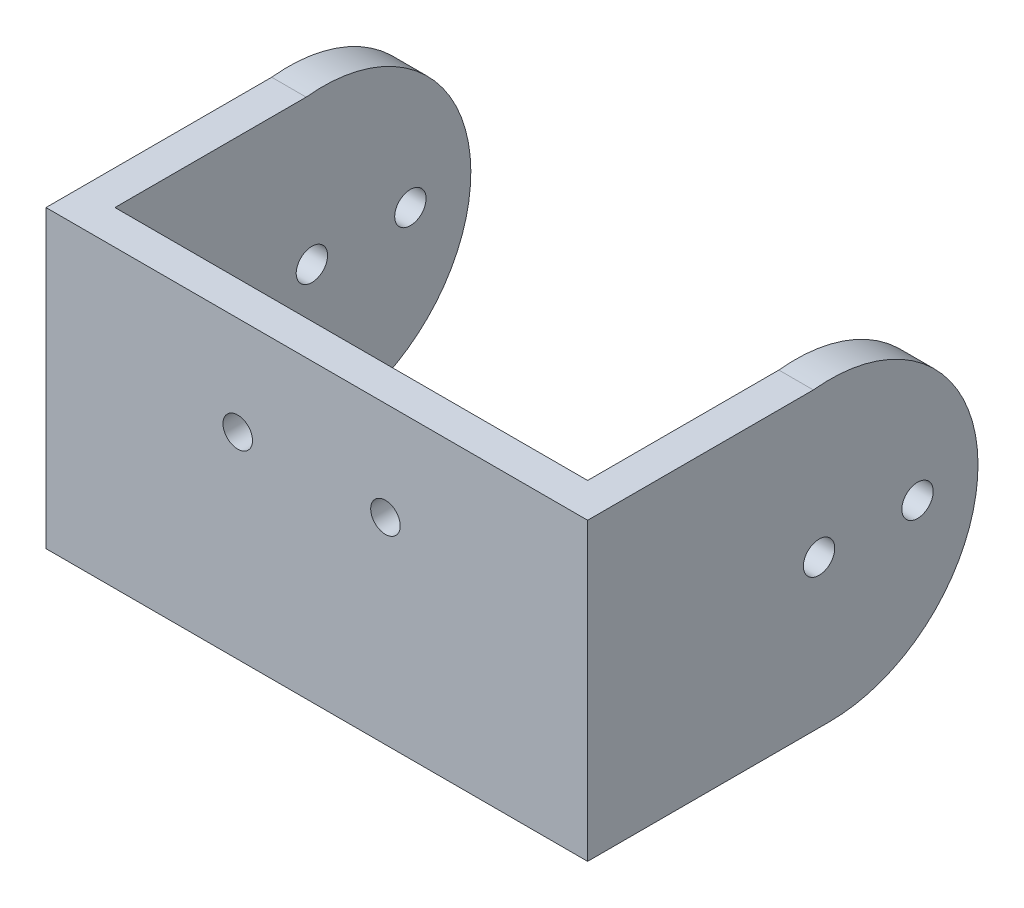
ISO-10303-21;
HEADER;
FILE_DESCRIPTION(('STEP AP214'),'2;1');
FILE_NAME('part.step','',(''),(''),'','','');
FILE_SCHEMA(('AUTOMOTIVE_DESIGN { 1 0 10303 214 1 1 1 1 }'));
ENDSEC;
DATA;
#1=APPLICATION_CONTEXT('core data for automotive mechanical design processes');
#2=APPLICATION_PROTOCOL_DEFINITION('international standard','automotive_design',2000,#1);
#3=PRODUCT_CONTEXT('',#1,'mechanical');
#4=PRODUCT('Part','Part','',(#3));
#5=PRODUCT_RELATED_PRODUCT_CATEGORY('part','',(#4));
#6=PRODUCT_DEFINITION_FORMATION('','',#4);
#7=PRODUCT_DEFINITION_CONTEXT('part definition',#1,'design');
#8=PRODUCT_DEFINITION('design','',#6,#7);
#9=PRODUCT_DEFINITION_SHAPE('','',#8);
#10=(LENGTH_UNIT() NAMED_UNIT(*) SI_UNIT(.MILLI.,.METRE.));
#11=(NAMED_UNIT(*) PLANE_ANGLE_UNIT() SI_UNIT($,.RADIAN.));
#12=(NAMED_UNIT(*) SI_UNIT($,.STERADIAN.) SOLID_ANGLE_UNIT());
#13=UNCERTAINTY_MEASURE_WITH_UNIT(LENGTH_MEASURE(1.E-05),#10,'distance_accuracy_value','');
#14=(GEOMETRIC_REPRESENTATION_CONTEXT(3) GLOBAL_UNCERTAINTY_ASSIGNED_CONTEXT((#13)) GLOBAL_UNIT_ASSIGNED_CONTEXT((#10,
#11,#12)) REPRESENTATION_CONTEXT('',''));
#15=CARTESIAN_POINT('',(0.,0.,0.));
#16=DIRECTION('',(0.,0.,1.));
#17=DIRECTION('',(1.,0.,0.));
#18=AXIS2_PLACEMENT_3D('',#15,#16,#17);
#19=CARTESIAN_POINT('',(-27.5,-15.,3.5));
#20=DIRECTION('',(1.,0.,0.));
#21=DIRECTION('',(0.,1.,0.));
#22=AXIS2_PLACEMENT_3D('',#19,#20,#21);
#23=PLANE('',#22);
#24=DIRECTION('',(0.,0.,-1.));
#25=VECTOR('',#24,1.);
#26=CARTESIAN_POINT('',(-27.5,15.,3.5));
#27=LINE('',#26,#25);
#28=CARTESIAN_POINT('',(-27.5,15.,3.5));
#29=VERTEX_POINT('',#28);
#30=CARTESIAN_POINT('',(-27.5,15.,-19.4197675165418));
#31=VERTEX_POINT('',#30);
#32=EDGE_CURVE('E200',#29,#31,#27,.T.);
#33=ORIENTED_EDGE('',*,*,#32,.T.);
#34=CARTESIAN_POINT('',(-27.5,0.046519708681584,-21.0930394173632));
#35=DIRECTION('',(1.,0.,0.));
#36=DIRECTION('',(0.,0.,1.));
#37=AXIS2_PLACEMENT_3D('',#34,#35,#36);
#38=CIRCLE('',#37,15.0468073582713);
#39=CARTESIAN_POINT('',(-27.5,-15.,-21.0000000000001));
#40=VERTEX_POINT('',#39);
#41=EDGE_CURVE('E118',#40,#31,#38,.T.);
#42=ORIENTED_EDGE('',*,*,#41,.F.);
#43=DIRECTION('',(0.,0.,-1.));
#44=VECTOR('',#43,1.);
#45=CARTESIAN_POINT('',(-27.5,-15.,3.5));
#46=LINE('',#45,#44);
#47=CARTESIAN_POINT('',(-27.5,-15.,3.5));
#48=VERTEX_POINT('',#47);
#49=EDGE_CURVE('E11',#48,#40,#46,.T.);
#50=ORIENTED_EDGE('',*,*,#49,.F.);
#51=DIRECTION('',(0.,-1.,0.));
#52=VECTOR('',#51,1.);
#53=CARTESIAN_POINT('',(-27.5,-15.,3.5));
#54=LINE('',#53,#52);
#55=EDGE_CURVE('E187',#29,#48,#54,.T.);
#56=ORIENTED_EDGE('',*,*,#55,.F.);
#57=EDGE_LOOP('',(#33,#42,#50,#56));
#58=FACE_BOUND('',#57,.T.);
#59=CARTESIAN_POINT('',(-27.5,0.,-20.));
#60=DIRECTION('',(1.,0.,0.));
#61=DIRECTION('',(0.,0.,-1.));
#62=AXIS2_PLACEMENT_3D('',#59,#60,#61);
#63=CIRCLE('',#62,1.59272352570657);
#64=CARTESIAN_POINT('',(-27.5,0.,-21.5927235257066));
#65=VERTEX_POINT('',#64);
#66=EDGE_CURVE('E136',#65,#65,#63,.T.);
#67=ORIENTED_EDGE('',*,*,#66,.T.);
#68=EDGE_LOOP('',(#67));
#69=FACE_BOUND('',#68,.T.);
#70=CARTESIAN_POINT('',(-27.5,-1.81701141093459E-13,-30.));
#71=DIRECTION('',(1.,0.,0.));
#72=DIRECTION('',(0.,0.,1.));
#73=AXIS2_PLACEMENT_3D('',#70,#71,#72);
#74=CIRCLE('',#73,1.59272352570657);
#75=CARTESIAN_POINT('',(-27.5,-1.81701141093459E-13,-28.4072764742934));
#76=VERTEX_POINT('',#75);
#77=EDGE_CURVE('E253',#76,#76,#74,.T.);
#78=ORIENTED_EDGE('',*,*,#77,.T.);
#79=EDGE_LOOP('',(#78));
#80=FACE_BOUND('',#79,.T.);
#81=ADVANCED_FACE('F39',(#58,#69,#80),#23,.F.);
#82=CARTESIAN_POINT('',(27.5,-15.,3.5));
#83=DIRECTION('',(0.,1.,0.));
#84=DIRECTION('',(-1.,0.,0.));
#85=AXIS2_PLACEMENT_3D('',#82,#83,#84);
#86=PLANE('',#85);
#87=ORIENTED_EDGE('',*,*,#49,.T.);
#88=DIRECTION('',(-1.,0.,0.));
#89=VECTOR('',#88,1.);
#90=CARTESIAN_POINT('',(-24.,-15.,-21.0000000000001));
#91=LINE('',#90,#89);
#92=CARTESIAN_POINT('',(-24.,-15.,-21.0000000000001));
#93=VERTEX_POINT('',#92);
#94=EDGE_CURVE('E122',#93,#40,#91,.T.);
#95=ORIENTED_EDGE('',*,*,#94,.F.);
#96=DIRECTION('',(0.,0.,-1.));
#97=VECTOR('',#96,1.);
#98=CARTESIAN_POINT('',(-24.,-15.,0.));
#99=LINE('',#98,#97);
#100=CARTESIAN_POINT('',(-24.,-15.,0.));
#101=VERTEX_POINT('',#100);
#102=EDGE_CURVE('E54',#101,#93,#99,.T.);
#103=ORIENTED_EDGE('',*,*,#102,.F.);
#104=DIRECTION('',(1.,0.,0.));
#105=VECTOR('',#104,1.);
#106=CARTESIAN_POINT('',(27.5,-15.,0.));
#107=LINE('',#106,#105);
#108=CARTESIAN_POINT('',(24.,-15.,0.));
#109=VERTEX_POINT('',#108);
#110=EDGE_CURVE('E59',#101,#109,#107,.T.);
#111=ORIENTED_EDGE('',*,*,#110,.T.);
#112=DIRECTION('',(0.,0.,-1.));
#113=VECTOR('',#112,1.);
#114=CARTESIAN_POINT('',(24.,-15.,0.));
#115=LINE('',#114,#113);
#116=CARTESIAN_POINT('',(24.,-15.,-21.0000000000001));
#117=VERTEX_POINT('',#116);
#118=EDGE_CURVE('E169',#109,#117,#115,.T.);
#119=ORIENTED_EDGE('',*,*,#118,.T.);
#120=DIRECTION('',(1.,0.,0.));
#121=VECTOR('',#120,1.);
#122=CARTESIAN_POINT('',(24.,-15.,-21.0000000000001));
#123=LINE('',#122,#121);
#124=CARTESIAN_POINT('',(27.5,-15.,-21.0000000000001));
#125=VERTEX_POINT('',#124);
#126=EDGE_CURVE('E176',#117,#125,#123,.T.);
#127=ORIENTED_EDGE('',*,*,#126,.T.);
#128=DIRECTION('',(0.,0.,-1.));
#129=VECTOR('',#128,1.);
#130=CARTESIAN_POINT('',(27.5,-15.,3.5));
#131=LINE('',#130,#129);
#132=CARTESIAN_POINT('',(27.5,-15.,3.5));
#133=VERTEX_POINT('',#132);
#134=EDGE_CURVE('E47',#133,#125,#131,.T.);
#135=ORIENTED_EDGE('',*,*,#134,.F.);
#136=DIRECTION('',(1.,0.,0.));
#137=VECTOR('',#136,1.);
#138=CARTESIAN_POINT('',(27.5,-15.,3.5));
#139=LINE('',#138,#137);
#140=EDGE_CURVE('E191',#48,#133,#139,.T.);
#141=ORIENTED_EDGE('',*,*,#140,.F.);
#142=EDGE_LOOP('',(#87,#95,#103,#111,#119,#127,#135,#141));
#143=FACE_BOUND('',#142,.T.);
#144=ADVANCED_FACE('F217',(#143),#86,.F.);
#145=CARTESIAN_POINT('',(27.5,-15.,3.5));
#146=DIRECTION('',(-1.,0.,0.));
#147=DIRECTION('',(0.,0.,1.));
#148=AXIS2_PLACEMENT_3D('',#145,#146,#147);
#149=PLANE('',#148);
#150=ORIENTED_EDGE('',*,*,#134,.T.);
#151=CARTESIAN_POINT('',(27.5,0.046519708681584,-21.0930394173632));
#152=DIRECTION('',(1.,0.,0.));
#153=DIRECTION('',(0.,0.,1.));
#154=AXIS2_PLACEMENT_3D('',#151,#152,#153);
#155=CIRCLE('',#154,15.0468073582713);
#156=CARTESIAN_POINT('',(27.5,15.,-19.4197675165418));
#157=VERTEX_POINT('',#156);
#158=EDGE_CURVE('E158',#125,#157,#155,.T.);
#159=ORIENTED_EDGE('',*,*,#158,.T.);
#160=DIRECTION('',(0.,0.,-1.));
#161=VECTOR('',#160,1.);
#162=CARTESIAN_POINT('',(27.5,15.,3.5));
#163=LINE('',#162,#161);
#164=CARTESIAN_POINT('',(27.5,15.,3.5));
#165=VERTEX_POINT('',#164);
#166=EDGE_CURVE('E207',#165,#157,#163,.T.);
#167=ORIENTED_EDGE('',*,*,#166,.F.);
#168=DIRECTION('',(0.,1.,0.));
#169=VECTOR('',#168,1.);
#170=CARTESIAN_POINT('',(27.5,-15.,3.5));
#171=LINE('',#170,#169);
#172=EDGE_CURVE('E194',#133,#165,#171,.T.);
#173=ORIENTED_EDGE('',*,*,#172,.F.);
#174=EDGE_LOOP('',(#150,#159,#167,#173));
#175=FACE_BOUND('',#174,.T.);
#176=CARTESIAN_POINT('',(27.5,-1.81701141093459E-13,-30.));
#177=DIRECTION('',(1.,0.,0.));
#178=DIRECTION('',(0.,0.,1.));
#179=AXIS2_PLACEMENT_3D('',#176,#177,#178);
#180=CIRCLE('',#179,1.59272352570657);
#181=CARTESIAN_POINT('',(27.5,-1.81701141093459E-13,-28.4072764742934));
#182=VERTEX_POINT('',#181);
#183=EDGE_CURVE('E144',#182,#182,#180,.T.);
#184=ORIENTED_EDGE('',*,*,#183,.F.);
#185=EDGE_LOOP('',(#184));
#186=FACE_BOUND('',#185,.T.);
#187=CARTESIAN_POINT('',(27.5,0.,-20.));
#188=DIRECTION('',(1.,0.,0.));
#189=DIRECTION('',(0.,0.,-1.));
#190=AXIS2_PLACEMENT_3D('',#187,#188,#189);
#191=CIRCLE('',#190,1.59272352570657);
#192=CARTESIAN_POINT('',(27.5,0.,-21.5927235257066));
#193=VERTEX_POINT('',#192);
#194=EDGE_CURVE('E150',#193,#193,#191,.T.);
#195=ORIENTED_EDGE('',*,*,#194,.F.);
#196=EDGE_LOOP('',(#195));
#197=FACE_BOUND('',#196,.T.);
#198=ADVANCED_FACE('F213',(#175,#186,#197),#149,.F.);
#199=CARTESIAN_POINT('',(27.5,15.,3.5));
#200=DIRECTION('',(0.,-1.,0.));
#201=DIRECTION('',(1.,0.,0.));
#202=AXIS2_PLACEMENT_3D('',#199,#200,#201);
#203=PLANE('',#202);
#204=ORIENTED_EDGE('',*,*,#166,.T.);
#205=DIRECTION('',(1.,0.,0.));
#206=VECTOR('',#205,1.);
#207=CARTESIAN_POINT('',(24.,15.,-19.4197675165418));
#208=LINE('',#207,#206);
#209=CARTESIAN_POINT('',(24.,15.,-19.4197675165418));
#210=VERTEX_POINT('',#209);
#211=EDGE_CURVE('E180',#210,#157,#208,.T.);
#212=ORIENTED_EDGE('',*,*,#211,.F.);
#213=DIRECTION('',(0.,0.,1.));
#214=VECTOR('',#213,1.);
#215=CARTESIAN_POINT('',(24.,15.,-19.4197675165418));
#216=LINE('',#215,#214);
#217=CARTESIAN_POINT('',(24.,15.,0.));
#218=VERTEX_POINT('',#217);
#219=EDGE_CURVE('E162',#210,#218,#216,.T.);
#220=ORIENTED_EDGE('',*,*,#219,.T.);
#221=DIRECTION('',(-1.,0.,0.));
#222=VECTOR('',#221,1.);
#223=CARTESIAN_POINT('',(27.5,15.,0.));
#224=LINE('',#223,#222);
#225=CARTESIAN_POINT('',(-24.,15.,0.));
#226=VERTEX_POINT('',#225);
#227=EDGE_CURVE('E129',#218,#226,#224,.T.);
#228=ORIENTED_EDGE('',*,*,#227,.T.);
#229=DIRECTION('',(0.,0.,1.));
#230=VECTOR('',#229,1.);
#231=CARTESIAN_POINT('',(-24.,15.,-19.4197675165418));
#232=LINE('',#231,#230);
#233=CARTESIAN_POINT('',(-24.,15.,-19.4197675165418));
#234=VERTEX_POINT('',#233);
#235=EDGE_CURVE('E107',#234,#226,#232,.T.);
#236=ORIENTED_EDGE('',*,*,#235,.F.);
#237=DIRECTION('',(-1.,0.,0.));
#238=VECTOR('',#237,1.);
#239=CARTESIAN_POINT('',(-24.,15.,-19.4197675165418));
#240=LINE('',#239,#238);
#241=EDGE_CURVE('E115',#234,#31,#240,.T.);
#242=ORIENTED_EDGE('',*,*,#241,.T.);
#243=ORIENTED_EDGE('',*,*,#32,.F.);
#244=DIRECTION('',(-1.,0.,0.));
#245=VECTOR('',#244,1.);
#246=CARTESIAN_POINT('',(27.5,15.,3.5));
#247=LINE('',#246,#245);
#248=EDGE_CURVE('E197',#165,#29,#247,.T.);
#249=ORIENTED_EDGE('',*,*,#248,.F.);
#250=EDGE_LOOP('',(#204,#212,#220,#228,#236,#242,#243,#249));
#251=FACE_BOUND('',#250,.T.);
#252=ADVANCED_FACE('F126',(#251),#203,.F.);
#253=CARTESIAN_POINT('',(0.,0.,3.5));
#254=DIRECTION('',(0.,0.,1.));
#255=DIRECTION('',(1.,0.,0.));
#256=AXIS2_PLACEMENT_3D('',#253,#254,#255);
#257=PLANE('',#256);
#258=CARTESIAN_POINT('',(6.97003369074222,4.99000000000001,3.5));
#259=DIRECTION('',(0.,0.,1.));
#260=DIRECTION('',(-1.,0.,0.));
#261=AXIS2_PLACEMENT_3D('',#258,#259,#260);
#262=CIRCLE('',#261,1.5);
#263=CARTESIAN_POINT('',(5.47003369074222,4.99000000000001,3.5));
#264=VERTEX_POINT('',#263);
#265=EDGE_CURVE('E263',#264,#264,#262,.T.);
#266=ORIENTED_EDGE('',*,*,#265,.F.);
#267=EDGE_LOOP('',(#266));
#268=FACE_BOUND('',#267,.T.);
#269=CARTESIAN_POINT('',(-8.02996630925778,4.99000000000001,3.5));
#270=DIRECTION('',(0.,0.,1.));
#271=DIRECTION('',(-1.,0.,0.));
#272=AXIS2_PLACEMENT_3D('',#269,#270,#271);
#273=CIRCLE('',#272,1.5);
#274=CARTESIAN_POINT('',(-9.52996630925778,4.99000000000001,3.5));
#275=VERTEX_POINT('',#274);
#276=EDGE_CURVE('E432',#275,#275,#273,.T.);
#277=ORIENTED_EDGE('',*,*,#276,.F.);
#278=EDGE_LOOP('',(#277));
#279=FACE_BOUND('',#278,.T.);
#280=ORIENTED_EDGE('',*,*,#55,.T.);
#281=ORIENTED_EDGE('',*,*,#140,.T.);
#282=ORIENTED_EDGE('',*,*,#172,.T.);
#283=ORIENTED_EDGE('',*,*,#248,.T.);
#284=EDGE_LOOP('',(#280,#281,#282,#283));
#285=FACE_BOUND('',#284,.T.);
#286=ADVANCED_FACE('F228',(#268,#279,#285),#257,.T.);
#287=CARTESIAN_POINT('',(0.,0.,0.));
#288=DIRECTION('',(0.,0.,1.));
#289=DIRECTION('',(1.,0.,0.));
#290=AXIS2_PLACEMENT_3D('',#287,#288,#289);
#291=PLANE('',#290);
#292=CARTESIAN_POINT('',(6.97003369074222,4.99000000000001,0.));
#293=DIRECTION('',(0.,0.,1.));
#294=DIRECTION('',(-1.,0.,0.));
#295=AXIS2_PLACEMENT_3D('',#292,#293,#294);
#296=CIRCLE('',#295,1.5);
#297=CARTESIAN_POINT('',(5.47003369074222,4.99000000000001,0.));
#298=VERTEX_POINT('',#297);
#299=EDGE_CURVE('E257',#298,#298,#296,.T.);
#300=ORIENTED_EDGE('',*,*,#299,.T.);
#301=EDGE_LOOP('',(#300));
#302=FACE_BOUND('',#301,.T.);
#303=CARTESIAN_POINT('',(-8.02996630925778,4.99000000000001,0.));
#304=DIRECTION('',(0.,0.,1.));
#305=DIRECTION('',(-1.,0.,0.));
#306=AXIS2_PLACEMENT_3D('',#303,#304,#305);
#307=CIRCLE('',#306,1.5);
#308=CARTESIAN_POINT('',(-9.52996630925778,4.99000000000001,0.));
#309=VERTEX_POINT('',#308);
#310=EDGE_CURVE('E428',#309,#309,#307,.T.);
#311=ORIENTED_EDGE('',*,*,#310,.T.);
#312=EDGE_LOOP('',(#311));
#313=FACE_BOUND('',#312,.T.);
#314=ORIENTED_EDGE('',*,*,#110,.F.);
#315=DIRECTION('',(0.,-1.,0.));
#316=VECTOR('',#315,1.);
#317=CARTESIAN_POINT('',(-24.,15.,0.));
#318=LINE('',#317,#316);
#319=EDGE_CURVE('E123',#226,#101,#318,.T.);
#320=ORIENTED_EDGE('',*,*,#319,.F.);
#321=ORIENTED_EDGE('',*,*,#227,.F.);
#322=DIRECTION('',(0.,-1.,0.));
#323=VECTOR('',#322,1.);
#324=CARTESIAN_POINT('',(24.,15.,0.));
#325=LINE('',#324,#323);
#326=EDGE_CURVE('E165',#218,#109,#325,.T.);
#327=ORIENTED_EDGE('',*,*,#326,.T.);
#328=EDGE_LOOP('',(#314,#320,#321,#327));
#329=FACE_BOUND('',#328,.T.);
#330=ADVANCED_FACE('F226',(#302,#313,#329),#291,.F.);
#331=CARTESIAN_POINT('',(24.,0.046519708681584,-21.0930394173632));
#332=DIRECTION('',(1.,0.,0.));
#333=DIRECTION('',(0.,0.,-1.));
#334=AXIS2_PLACEMENT_3D('',#331,#332,#333);
#335=CYLINDRICAL_SURFACE('',#334,15.0468073582713);
#336=ORIENTED_EDGE('',*,*,#158,.F.);
#337=ORIENTED_EDGE('',*,*,#126,.F.);
#338=CARTESIAN_POINT('',(24.,0.046519708681584,-21.0930394173632));
#339=DIRECTION('',(1.,0.,0.));
#340=DIRECTION('',(0.,0.,1.));
#341=AXIS2_PLACEMENT_3D('',#338,#339,#340);
#342=CIRCLE('',#341,15.0468073582713);
#343=EDGE_CURVE('E172',#117,#210,#342,.T.);
#344=ORIENTED_EDGE('',*,*,#343,.T.);
#345=ORIENTED_EDGE('',*,*,#211,.T.);
#346=EDGE_LOOP('',(#336,#337,#344,#345));
#347=FACE_BOUND('',#346,.T.);
#348=ADVANCED_FACE('F220',(#347),#335,.T.);
#349=CARTESIAN_POINT('',(24.,0.046519708681584,-21.0930394173632));
#350=DIRECTION('',(-1.,0.,0.));
#351=DIRECTION('',(0.,0.,1.));
#352=AXIS2_PLACEMENT_3D('',#349,#350,#351);
#353=PLANE('',#352);
#354=CARTESIAN_POINT('',(24.,-1.81701141093459E-13,-30.));
#355=DIRECTION('',(1.,0.,0.));
#356=DIRECTION('',(0.,0.,1.));
#357=AXIS2_PLACEMENT_3D('',#354,#355,#356);
#358=CIRCLE('',#357,1.59272352570657);
#359=CARTESIAN_POINT('',(24.,-1.81701141093459E-13,-28.4072764742934));
#360=VERTEX_POINT('',#359);
#361=EDGE_CURVE('E146',#360,#360,#358,.T.);
#362=ORIENTED_EDGE('',*,*,#361,.T.);
#363=EDGE_LOOP('',(#362));
#364=FACE_BOUND('',#363,.T.);
#365=CARTESIAN_POINT('',(24.,0.,-20.));
#366=DIRECTION('',(1.,0.,0.));
#367=DIRECTION('',(0.,0.,-1.));
#368=AXIS2_PLACEMENT_3D('',#365,#366,#367);
#369=CIRCLE('',#368,1.59272352570657);
#370=CARTESIAN_POINT('',(24.,0.,-21.5927235257066));
#371=VERTEX_POINT('',#370);
#372=EDGE_CURVE('E154',#371,#371,#369,.T.);
#373=ORIENTED_EDGE('',*,*,#372,.T.);
#374=EDGE_LOOP('',(#373));
#375=FACE_BOUND('',#374,.T.);
#376=ORIENTED_EDGE('',*,*,#219,.F.);
#377=ORIENTED_EDGE('',*,*,#343,.F.);
#378=ORIENTED_EDGE('',*,*,#118,.F.);
#379=ORIENTED_EDGE('',*,*,#326,.F.);
#380=EDGE_LOOP('',(#376,#377,#378,#379));
#381=FACE_BOUND('',#380,.T.);
#382=ADVANCED_FACE('F224',(#364,#375,#381),#353,.T.);
#383=CARTESIAN_POINT('',(24.,0.,-20.));
#384=DIRECTION('',(1.,0.,0.));
#385=DIRECTION('',(0.,0.,-1.));
#386=AXIS2_PLACEMENT_3D('',#383,#384,#385);
#387=CYLINDRICAL_SURFACE('',#386,1.59272352570657);
#388=ORIENTED_EDGE('',*,*,#372,.F.);
#389=EDGE_LOOP('',(#388));
#390=FACE_BOUND('',#389,.T.);
#391=ORIENTED_EDGE('',*,*,#194,.T.);
#392=EDGE_LOOP('',(#391));
#393=FACE_BOUND('',#392,.T.);
#394=ADVANCED_FACE('F282',(#390,#393),#387,.F.);
#395=CARTESIAN_POINT('',(24.,-1.81701141093459E-13,-30.));
#396=DIRECTION('',(1.,0.,0.));
#397=DIRECTION('',(0.,0.,-1.));
#398=AXIS2_PLACEMENT_3D('',#395,#396,#397);
#399=CYLINDRICAL_SURFACE('',#398,1.59272352570657);
#400=ORIENTED_EDGE('',*,*,#361,.F.);
#401=EDGE_LOOP('',(#400));
#402=FACE_BOUND('',#401,.T.);
#403=ORIENTED_EDGE('',*,*,#183,.T.);
#404=EDGE_LOOP('',(#403));
#405=FACE_BOUND('',#404,.T.);
#406=ADVANCED_FACE('F275',(#402,#405),#399,.F.);
#407=CARTESIAN_POINT('',(-24.,0.046519708681584,-21.0930394173632));
#408=DIRECTION('',(1.,0.,0.));
#409=DIRECTION('',(0.,0.,1.));
#410=AXIS2_PLACEMENT_3D('',#407,#408,#409);
#411=PLANE('',#410);
#412=CARTESIAN_POINT('',(-24.,0.,-20.));
#413=DIRECTION('',(1.,0.,0.));
#414=DIRECTION('',(0.,0.,-1.));
#415=AXIS2_PLACEMENT_3D('',#412,#413,#414);
#416=CIRCLE('',#415,1.59272352570657);
#417=CARTESIAN_POINT('',(-24.,0.,-21.5927235257066));
#418=VERTEX_POINT('',#417);
#419=EDGE_CURVE('E133',#418,#418,#416,.T.);
#420=ORIENTED_EDGE('',*,*,#419,.F.);
#421=EDGE_LOOP('',(#420));
#422=FACE_BOUND('',#421,.T.);
#423=ORIENTED_EDGE('',*,*,#235,.T.);
#424=ORIENTED_EDGE('',*,*,#319,.T.);
#425=ORIENTED_EDGE('',*,*,#102,.T.);
#426=CARTESIAN_POINT('',(-24.,0.046519708681584,-21.0930394173632));
#427=DIRECTION('',(1.,0.,0.));
#428=DIRECTION('',(0.,0.,1.));
#429=AXIS2_PLACEMENT_3D('',#426,#427,#428);
#430=CIRCLE('',#429,15.0468073582713);
#431=EDGE_CURVE('E102',#93,#234,#430,.T.);
#432=ORIENTED_EDGE('',*,*,#431,.T.);
#433=EDGE_LOOP('',(#423,#424,#425,#432));
#434=FACE_BOUND('',#433,.T.);
#435=CARTESIAN_POINT('',(-24.,-1.81701141093459E-13,-30.));
#436=DIRECTION('',(1.,0.,0.));
#437=DIRECTION('',(0.,0.,1.));
#438=AXIS2_PLACEMENT_3D('',#435,#436,#437);
#439=CIRCLE('',#438,1.59272352570657);
#440=CARTESIAN_POINT('',(-24.,-1.81701141093459E-13,-28.4072764742934));
#441=VERTEX_POINT('',#440);
#442=EDGE_CURVE('E256',#441,#441,#439,.T.);
#443=ORIENTED_EDGE('',*,*,#442,.F.);
#444=EDGE_LOOP('',(#443));
#445=FACE_BOUND('',#444,.T.);
#446=ADVANCED_FACE('F104',(#422,#434,#445),#411,.T.);
#447=CARTESIAN_POINT('',(-24.,0.046519708681584,-21.0930394173632));
#448=DIRECTION('',(-1.,0.,0.));
#449=DIRECTION('',(0.,0.,1.));
#450=AXIS2_PLACEMENT_3D('',#447,#448,#449);
#451=CYLINDRICAL_SURFACE('',#450,15.0468073582713);
#452=ORIENTED_EDGE('',*,*,#41,.T.);
#453=ORIENTED_EDGE('',*,*,#241,.F.);
#454=ORIENTED_EDGE('',*,*,#431,.F.);
#455=ORIENTED_EDGE('',*,*,#94,.T.);
#456=EDGE_LOOP('',(#452,#453,#454,#455));
#457=FACE_BOUND('',#456,.T.);
#458=ADVANCED_FACE('F116',(#457),#451,.T.);
#459=CARTESIAN_POINT('',(-24.,0.,-20.));
#460=DIRECTION('',(-1.,0.,0.));
#461=DIRECTION('',(0.,0.,1.));
#462=AXIS2_PLACEMENT_3D('',#459,#460,#461);
#463=CYLINDRICAL_SURFACE('',#462,1.59272352570657);
#464=ORIENTED_EDGE('',*,*,#419,.T.);
#465=EDGE_LOOP('',(#464));
#466=FACE_BOUND('',#465,.T.);
#467=ORIENTED_EDGE('',*,*,#66,.F.);
#468=EDGE_LOOP('',(#467));
#469=FACE_BOUND('',#468,.T.);
#470=ADVANCED_FACE('F271',(#466,#469),#463,.F.);
#471=CARTESIAN_POINT('',(-24.,-1.81701141093459E-13,-30.));
#472=DIRECTION('',(-1.,0.,0.));
#473=DIRECTION('',(0.,0.,1.));
#474=AXIS2_PLACEMENT_3D('',#471,#472,#473);
#475=CYLINDRICAL_SURFACE('',#474,1.59272352570657);
#476=ORIENTED_EDGE('',*,*,#442,.T.);
#477=EDGE_LOOP('',(#476));
#478=FACE_BOUND('',#477,.T.);
#479=ORIENTED_EDGE('',*,*,#77,.F.);
#480=EDGE_LOOP('',(#479));
#481=FACE_BOUND('',#480,.T.);
#482=ADVANCED_FACE('F320',(#478,#481),#475,.F.);
#483=CARTESIAN_POINT('',(-8.02996630925778,4.99000000000001,0.));
#484=DIRECTION('',(0.,0.,1.));
#485=DIRECTION('',(1.,0.,0.));
#486=AXIS2_PLACEMENT_3D('',#483,#484,#485);
#487=CYLINDRICAL_SURFACE('',#486,1.5);
#488=ORIENTED_EDGE('',*,*,#310,.F.);
#489=EDGE_LOOP('',(#488));
#490=FACE_BOUND('',#489,.T.);
#491=ORIENTED_EDGE('',*,*,#276,.T.);
#492=EDGE_LOOP('',(#491));
#493=FACE_BOUND('',#492,.T.);
#494=ADVANCED_FACE('F330',(#490,#493),#487,.F.);
#495=CARTESIAN_POINT('',(6.97003369074222,4.99000000000001,0.));
#496=DIRECTION('',(0.,0.,1.));
#497=DIRECTION('',(1.,0.,0.));
#498=AXIS2_PLACEMENT_3D('',#495,#496,#497);
#499=CYLINDRICAL_SURFACE('',#498,1.5);
#500=ORIENTED_EDGE('',*,*,#299,.F.);
#501=EDGE_LOOP('',(#500));
#502=FACE_BOUND('',#501,.T.);
#503=ORIENTED_EDGE('',*,*,#265,.T.);
#504=EDGE_LOOP('',(#503));
#505=FACE_BOUND('',#504,.T.);
#506=ADVANCED_FACE('F335',(#502,#505),#499,.F.);
#507=CLOSED_SHELL('',(#81,#144,#198,#252,#286,#330,#348,#382,#394,#406,#446,#458,#470,#482,#494,#506));
#508=MANIFOLD_SOLID_BREP('B2',#507);
#509=ADVANCED_BREP_SHAPE_REPRESENTATION('',(#18,#508),#14);
#510=SHAPE_DEFINITION_REPRESENTATION(#9,#509);
ENDSEC;
END-ISO-10303-21;
